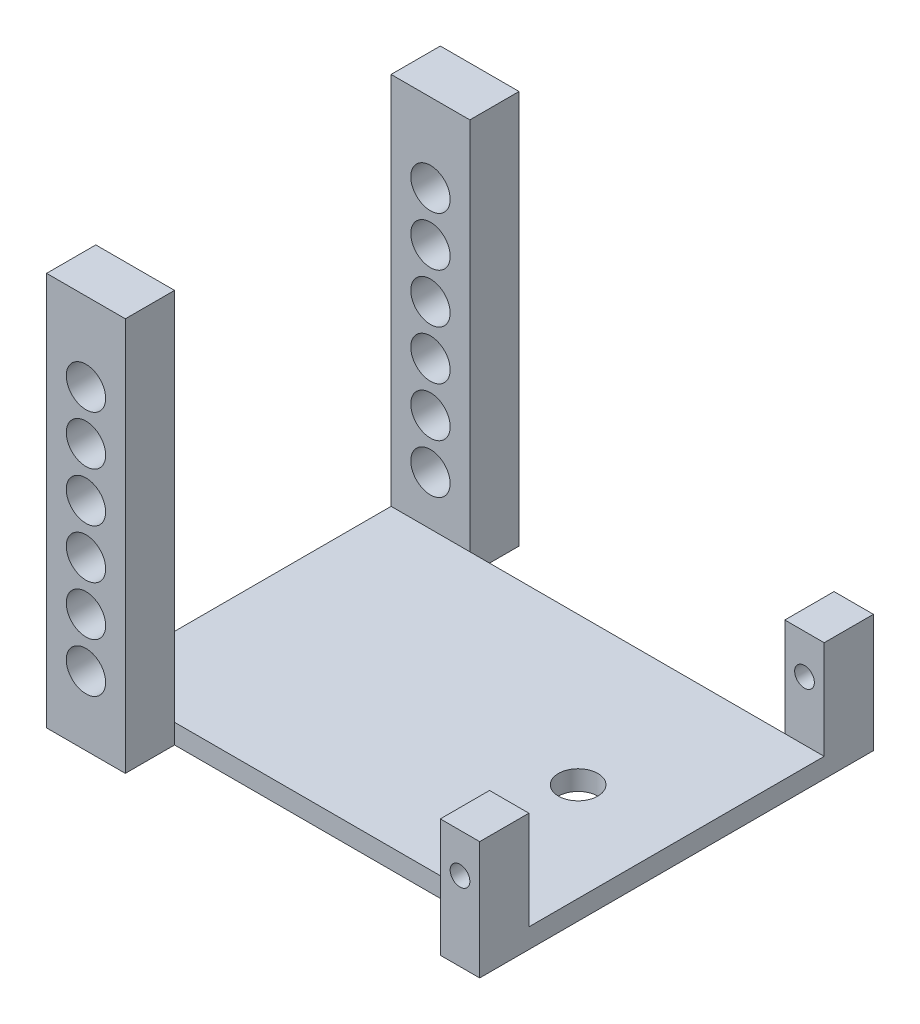
ISO-10303-21;
HEADER;
FILE_DESCRIPTION(('STEP AP214'),'2;1');
FILE_NAME('part.step','',(''),(''),'','','');
FILE_SCHEMA(('AUTOMOTIVE_DESIGN { 1 0 10303 214 1 1 1 1 }'));
ENDSEC;
DATA;
#1=APPLICATION_CONTEXT('core data for automotive mechanical design processes');
#2=APPLICATION_PROTOCOL_DEFINITION('international standard','automotive_design',2000,#1);
#3=PRODUCT_CONTEXT('',#1,'mechanical');
#4=PRODUCT('Part','Part','',(#3));
#5=PRODUCT_RELATED_PRODUCT_CATEGORY('part','',(#4));
#6=PRODUCT_DEFINITION_FORMATION('','',#4);
#7=PRODUCT_DEFINITION_CONTEXT('part definition',#1,'design');
#8=PRODUCT_DEFINITION('design','',#6,#7);
#9=PRODUCT_DEFINITION_SHAPE('','',#8);
#10=(LENGTH_UNIT() NAMED_UNIT(*) SI_UNIT(.MILLI.,.METRE.));
#11=(NAMED_UNIT(*) PLANE_ANGLE_UNIT() SI_UNIT($,.RADIAN.));
#12=(NAMED_UNIT(*) SI_UNIT($,.STERADIAN.) SOLID_ANGLE_UNIT());
#13=UNCERTAINTY_MEASURE_WITH_UNIT(LENGTH_MEASURE(1.E-05),#10,'distance_accuracy_value','');
#14=(GEOMETRIC_REPRESENTATION_CONTEXT(3) GLOBAL_UNCERTAINTY_ASSIGNED_CONTEXT((#13)) GLOBAL_UNIT_ASSIGNED_CONTEXT((#10,
#11,#12)) REPRESENTATION_CONTEXT('',''));
#15=CARTESIAN_POINT('',(0.,0.,0.));
#16=DIRECTION('',(0.,0.,1.));
#17=DIRECTION('',(1.,0.,0.));
#18=AXIS2_PLACEMENT_3D('',#15,#16,#17);
#19=CARTESIAN_POINT('',(-100.,10.,-75.));
#20=DIRECTION('',(0.,0.,1.));
#21=DIRECTION('',(1.,0.,0.));
#22=AXIS2_PLACEMENT_3D('',#19,#20,#21);
#23=PLANE('',#22);
#24=DIRECTION('',(0.,-1.,0.));
#25=VECTOR('',#24,1.);
#26=CARTESIAN_POINT('',(-80.,0.,-75.));
#27=LINE('',#26,#25);
#28=CARTESIAN_POINT('',(-80.,10.,-75.));
#29=VERTEX_POINT('',#28);
#30=CARTESIAN_POINT('',(-80.,0.,-75.));
#31=VERTEX_POINT('',#30);
#32=EDGE_CURVE('E206',#29,#31,#27,.T.);
#33=ORIENTED_EDGE('',*,*,#32,.F.);
#34=DIRECTION('',(-1.,0.,0.));
#35=VECTOR('',#34,1.);
#36=CARTESIAN_POINT('',(-100.,10.,-75.));
#37=LINE('',#36,#35);
#38=CARTESIAN_POINT('',(80.,10.,-75.));
#39=VERTEX_POINT('',#38);
#40=EDGE_CURVE('E348',#39,#29,#37,.T.);
#41=ORIENTED_EDGE('',*,*,#40,.F.);
#42=DIRECTION('',(0.,1.,0.));
#43=VECTOR('',#42,1.);
#44=CARTESIAN_POINT('',(80.,60.,-75.));
#45=LINE('',#44,#43);
#46=CARTESIAN_POINT('',(80.,0.,-75.));
#47=VERTEX_POINT('',#46);
#48=EDGE_CURVE('E64',#47,#39,#45,.T.);
#49=ORIENTED_EDGE('',*,*,#48,.F.);
#50=DIRECTION('',(-1.,0.,0.));
#51=VECTOR('',#50,1.);
#52=CARTESIAN_POINT('',(-100.,0.,-75.));
#53=LINE('',#52,#51);
#54=EDGE_CURVE('E358',#47,#31,#53,.T.);
#55=ORIENTED_EDGE('',*,*,#54,.T.);
#56=EDGE_LOOP('',(#33,#41,#49,#55));
#57=FACE_BOUND('',#56,.T.);
#58=ADVANCED_FACE('F45',(#57),#23,.F.);
#59=CARTESIAN_POINT('',(-100.,10.,75.));
#60=DIRECTION('',(0.,0.,-1.));
#61=DIRECTION('',(-1.,0.,0.));
#62=AXIS2_PLACEMENT_3D('',#59,#60,#61);
#63=PLANE('',#62);
#64=DIRECTION('',(0.,1.,0.));
#65=VECTOR('',#64,1.);
#66=CARTESIAN_POINT('',(-80.,200.,75.));
#67=LINE('',#66,#65);
#68=CARTESIAN_POINT('',(-80.,0.,75.));
#69=VERTEX_POINT('',#68);
#70=CARTESIAN_POINT('',(-80.,10.,75.));
#71=VERTEX_POINT('',#70);
#72=EDGE_CURVE('E280',#69,#71,#67,.T.);
#73=ORIENTED_EDGE('',*,*,#72,.F.);
#74=DIRECTION('',(1.,0.,0.));
#75=VECTOR('',#74,1.);
#76=CARTESIAN_POINT('',(-100.,0.,75.));
#77=LINE('',#76,#75);
#78=CARTESIAN_POINT('',(80.,0.,75.));
#79=VERTEX_POINT('',#78);
#80=EDGE_CURVE('E349',#69,#79,#77,.T.);
#81=ORIENTED_EDGE('',*,*,#80,.T.);
#82=DIRECTION('',(0.,-1.,0.));
#83=VECTOR('',#82,1.);
#84=CARTESIAN_POINT('',(80.,60.,75.));
#85=LINE('',#84,#83);
#86=CARTESIAN_POINT('',(80.,10.,75.));
#87=VERTEX_POINT('',#86);
#88=EDGE_CURVE('E11',#87,#79,#85,.T.);
#89=ORIENTED_EDGE('',*,*,#88,.F.);
#90=DIRECTION('',(1.,0.,0.));
#91=VECTOR('',#90,1.);
#92=CARTESIAN_POINT('',(-100.,10.,75.));
#93=LINE('',#92,#91);
#94=EDGE_CURVE('E72',#71,#87,#93,.T.);
#95=ORIENTED_EDGE('',*,*,#94,.F.);
#96=EDGE_LOOP('',(#73,#81,#89,#95));
#97=FACE_BOUND('',#96,.T.);
#98=ADVANCED_FACE('F515',(#97),#63,.F.);
#99=CARTESIAN_POINT('',(100.,10.,-75.));
#100=DIRECTION('',(-1.,0.,0.));
#101=DIRECTION('',(0.,0.,1.));
#102=AXIS2_PLACEMENT_3D('',#99,#100,#101);
#103=PLANE('',#102);
#104=DIRECTION('',(0.,0.,-1.));
#105=VECTOR('',#104,1.);
#106=CARTESIAN_POINT('',(100.,0.,-75.));
#107=LINE('',#106,#105);
#108=CARTESIAN_POINT('',(100.,0.,100.));
#109=VERTEX_POINT('',#108);
#110=CARTESIAN_POINT('',(100.,0.,-100.));
#111=VERTEX_POINT('',#110);
#112=EDGE_CURVE('E341',#109,#111,#107,.T.);
#113=ORIENTED_EDGE('',*,*,#112,.T.);
#114=DIRECTION('',(0.,-1.,0.));
#115=VECTOR('',#114,1.);
#116=CARTESIAN_POINT('',(100.,0.,-100.));
#117=LINE('',#116,#115);
#118=CARTESIAN_POINT('',(100.,60.,-100.));
#119=VERTEX_POINT('',#118);
#120=EDGE_CURVE('E236',#119,#111,#117,.T.);
#121=ORIENTED_EDGE('',*,*,#120,.F.);
#122=DIRECTION('',(0.,0.,1.));
#123=VECTOR('',#122,1.);
#124=CARTESIAN_POINT('',(100.,60.,-100.));
#125=LINE('',#124,#123);
#126=CARTESIAN_POINT('',(100.,60.,-75.));
#127=VERTEX_POINT('',#126);
#128=EDGE_CURVE('E240',#119,#127,#125,.T.);
#129=ORIENTED_EDGE('',*,*,#128,.T.);
#130=DIRECTION('',(0.,-1.,0.));
#131=VECTOR('',#130,1.);
#132=CARTESIAN_POINT('',(100.,0.,-75.));
#133=LINE('',#132,#131);
#134=CARTESIAN_POINT('',(100.,10.,-75.));
#135=VERTEX_POINT('',#134);
#136=EDGE_CURVE('E230',#127,#135,#133,.T.);
#137=ORIENTED_EDGE('',*,*,#136,.T.);
#138=DIRECTION('',(0.,0.,-1.));
#139=VECTOR('',#138,1.);
#140=CARTESIAN_POINT('',(100.,10.,-75.));
#141=LINE('',#140,#139);
#142=CARTESIAN_POINT('',(100.,10.,75.));
#143=VERTEX_POINT('',#142);
#144=EDGE_CURVE('E345',#143,#135,#141,.T.);
#145=ORIENTED_EDGE('',*,*,#144,.F.);
#146=DIRECTION('',(0.,1.,0.));
#147=VECTOR('',#146,1.);
#148=CARTESIAN_POINT('',(100.,0.,75.));
#149=LINE('',#148,#147);
#150=CARTESIAN_POINT('',(100.,60.,75.));
#151=VERTEX_POINT('',#150);
#152=EDGE_CURVE('E284',#143,#151,#149,.T.);
#153=ORIENTED_EDGE('',*,*,#152,.T.);
#154=DIRECTION('',(0.,0.,-1.));
#155=VECTOR('',#154,1.);
#156=CARTESIAN_POINT('',(100.,60.,100.));
#157=LINE('',#156,#155);
#158=CARTESIAN_POINT('',(100.,60.,100.));
#159=VERTEX_POINT('',#158);
#160=EDGE_CURVE('E325',#159,#151,#157,.T.);
#161=ORIENTED_EDGE('',*,*,#160,.F.);
#162=DIRECTION('',(0.,1.,0.));
#163=VECTOR('',#162,1.);
#164=CARTESIAN_POINT('',(100.,0.,100.));
#165=LINE('',#164,#163);
#166=EDGE_CURVE('E301',#109,#159,#165,.T.);
#167=ORIENTED_EDGE('',*,*,#166,.F.);
#168=EDGE_LOOP('',(#113,#121,#129,#137,#145,#153,#161,#167));
#169=FACE_BOUND('',#168,.T.);
#170=ADVANCED_FACE('F47',(#169),#103,.F.);
#171=CARTESIAN_POINT('',(0.,10.,0.));
#172=DIRECTION('',(0.,1.,0.));
#173=DIRECTION('',(0.,0.,1.));
#174=AXIS2_PLACEMENT_3D('',#171,#172,#173);
#175=PLANE('',#174);
#176=CARTESIAN_POINT('',(50.,10.,0.));
#177=DIRECTION('',(0.,1.,0.));
#178=DIRECTION('',(0.,0.,1.));
#179=AXIS2_PLACEMENT_3D('',#176,#177,#178);
#180=CIRCLE('',#179,10.);
#181=CARTESIAN_POINT('',(50.,10.,9.99999999999999));
#182=VERTEX_POINT('',#181);
#183=EDGE_CURVE('E336',#182,#182,#180,.T.);
#184=ORIENTED_EDGE('',*,*,#183,.F.);
#185=EDGE_LOOP('',(#184));
#186=FACE_BOUND('',#185,.T.);
#187=ORIENTED_EDGE('',*,*,#144,.T.);
#188=EDGE_CURVE('E350',#135,#39,#37,.T.);
#189=ORIENTED_EDGE('',*,*,#188,.T.);
#190=ORIENTED_EDGE('',*,*,#40,.T.);
#191=DIRECTION('',(1.,0.,0.));
#192=VECTOR('',#191,1.);
#193=CARTESIAN_POINT('',(0.,10.,-75.));
#194=LINE('',#193,#192);
#195=CARTESIAN_POINT('',(-120.,10.,-75.));
#196=VERTEX_POINT('',#195);
#197=EDGE_CURVE('E204',#196,#29,#194,.T.);
#198=ORIENTED_EDGE('',*,*,#197,.F.);
#199=DIRECTION('',(0.,0.,-1.));
#200=VECTOR('',#199,1.);
#201=CARTESIAN_POINT('',(-120.,10.,-75.));
#202=LINE('',#201,#200);
#203=CARTESIAN_POINT('',(-120.,10.,75.));
#204=VERTEX_POINT('',#203);
#205=EDGE_CURVE('E329',#204,#196,#202,.T.);
#206=ORIENTED_EDGE('',*,*,#205,.F.);
#207=EDGE_CURVE('E55',#204,#71,#93,.T.);
#208=ORIENTED_EDGE('',*,*,#207,.T.);
#209=ORIENTED_EDGE('',*,*,#94,.T.);
#210=EDGE_CURVE('E353',#87,#143,#93,.T.);
#211=ORIENTED_EDGE('',*,*,#210,.T.);
#212=EDGE_LOOP('',(#187,#189,#190,#198,#206,#208,#209,#211));
#213=FACE_BOUND('',#212,.T.);
#214=ADVANCED_FACE('F528',(#186,#213),#175,.T.);
#215=CARTESIAN_POINT('',(0.,0.,0.));
#216=DIRECTION('',(0.,1.,0.));
#217=DIRECTION('',(0.,0.,1.));
#218=AXIS2_PLACEMENT_3D('',#215,#216,#217);
#219=PLANE('',#218);
#220=CARTESIAN_POINT('',(50.,0.,0.));
#221=DIRECTION('',(0.,1.,0.));
#222=DIRECTION('',(0.,0.,1.));
#223=AXIS2_PLACEMENT_3D('',#220,#221,#222);
#224=CIRCLE('',#223,10.);
#225=CARTESIAN_POINT('',(50.,0.,9.99999999999999));
#226=VERTEX_POINT('',#225);
#227=EDGE_CURVE('E337',#226,#226,#224,.T.);
#228=ORIENTED_EDGE('',*,*,#227,.T.);
#229=EDGE_LOOP('',(#228));
#230=FACE_BOUND('',#229,.T.);
#231=ORIENTED_EDGE('',*,*,#112,.F.);
#232=DIRECTION('',(1.,0.,0.));
#233=VECTOR('',#232,1.);
#234=CARTESIAN_POINT('',(80.,0.,100.));
#235=LINE('',#234,#233);
#236=CARTESIAN_POINT('',(80.,0.,100.));
#237=VERTEX_POINT('',#236);
#238=EDGE_CURVE('E297',#237,#109,#235,.T.);
#239=ORIENTED_EDGE('',*,*,#238,.F.);
#240=DIRECTION('',(0.,0.,-1.));
#241=VECTOR('',#240,1.);
#242=CARTESIAN_POINT('',(80.,0.,100.));
#243=LINE('',#242,#241);
#244=EDGE_CURVE('E310',#237,#79,#243,.T.);
#245=ORIENTED_EDGE('',*,*,#244,.T.);
#246=ORIENTED_EDGE('',*,*,#80,.F.);
#247=DIRECTION('',(0.,0.,-1.));
#248=VECTOR('',#247,1.);
#249=CARTESIAN_POINT('',(-80.,0.,100.));
#250=LINE('',#249,#248);
#251=CARTESIAN_POINT('',(-80.,0.,100.));
#252=VERTEX_POINT('',#251);
#253=EDGE_CURVE('E260',#252,#69,#250,.T.);
#254=ORIENTED_EDGE('',*,*,#253,.F.);
#255=DIRECTION('',(1.,0.,0.));
#256=VECTOR('',#255,1.);
#257=CARTESIAN_POINT('',(-80.,0.,100.));
#258=LINE('',#257,#256);
#259=CARTESIAN_POINT('',(-120.,0.,100.));
#260=VERTEX_POINT('',#259);
#261=EDGE_CURVE('E276',#260,#252,#258,.T.);
#262=ORIENTED_EDGE('',*,*,#261,.F.);
#263=DIRECTION('',(0.,0.,1.));
#264=VECTOR('',#263,1.);
#265=CARTESIAN_POINT('',(-120.,0.,-75.));
#266=LINE('',#265,#264);
#267=CARTESIAN_POINT('',(-120.,0.,-100.));
#268=VERTEX_POINT('',#267);
#269=EDGE_CURVE('E333',#268,#260,#266,.T.);
#270=ORIENTED_EDGE('',*,*,#269,.F.);
#271=DIRECTION('',(-1.,0.,0.));
#272=VECTOR('',#271,1.);
#273=CARTESIAN_POINT('',(-120.,0.,-100.));
#274=LINE('',#273,#272);
#275=CARTESIAN_POINT('',(-80.,0.,-100.));
#276=VERTEX_POINT('',#275);
#277=EDGE_CURVE('E219',#276,#268,#274,.T.);
#278=ORIENTED_EDGE('',*,*,#277,.F.);
#279=DIRECTION('',(0.,0.,1.));
#280=VECTOR('',#279,1.);
#281=CARTESIAN_POINT('',(-80.,0.,-100.));
#282=LINE('',#281,#280);
#283=EDGE_CURVE('E434',#276,#31,#282,.T.);
#284=ORIENTED_EDGE('',*,*,#283,.T.);
#285=ORIENTED_EDGE('',*,*,#54,.F.);
#286=DIRECTION('',(0.,0.,1.));
#287=VECTOR('',#286,1.);
#288=CARTESIAN_POINT('',(80.,0.,-100.));
#289=LINE('',#288,#287);
#290=CARTESIAN_POINT('',(80.,0.,-100.));
#291=VERTEX_POINT('',#290);
#292=EDGE_CURVE('E256',#291,#47,#289,.T.);
#293=ORIENTED_EDGE('',*,*,#292,.F.);
#294=DIRECTION('',(-1.,0.,0.));
#295=VECTOR('',#294,1.);
#296=CARTESIAN_POINT('',(80.,0.,-100.));
#297=LINE('',#296,#295);
#298=EDGE_CURVE('E225',#111,#291,#297,.T.);
#299=ORIENTED_EDGE('',*,*,#298,.F.);
#300=EDGE_LOOP('',(#231,#239,#245,#246,#254,#262,#270,#278,#284,#285,#293,#299));
#301=FACE_BOUND('',#300,.T.);
#302=ADVANCED_FACE('F524',(#230,#301),#219,.F.);
#303=CARTESIAN_POINT('',(50.,0.,0.));
#304=DIRECTION('',(0.,1.,0.));
#305=DIRECTION('',(0.,0.,1.));
#306=AXIS2_PLACEMENT_3D('',#303,#304,#305);
#307=CYLINDRICAL_SURFACE('',#306,10.);
#308=ORIENTED_EDGE('',*,*,#227,.F.);
#309=EDGE_LOOP('',(#308));
#310=FACE_BOUND('',#309,.T.);
#311=ORIENTED_EDGE('',*,*,#183,.T.);
#312=EDGE_LOOP('',(#311));
#313=FACE_BOUND('',#312,.T.);
#314=ADVANCED_FACE('F527',(#310,#313),#307,.F.);
#315=CARTESIAN_POINT('',(-120.,0.,0.));
#316=DIRECTION('',(-1.,0.,0.));
#317=DIRECTION('',(0.,0.,1.));
#318=AXIS2_PLACEMENT_3D('',#315,#316,#317);
#319=PLANE('',#318);
#320=ORIENTED_EDGE('',*,*,#269,.T.);
#321=DIRECTION('',(0.,-1.,0.));
#322=VECTOR('',#321,1.);
#323=CARTESIAN_POINT('',(-120.,200.,100.));
#324=LINE('',#323,#322);
#325=CARTESIAN_POINT('',(-120.,200.,100.));
#326=VERTEX_POINT('',#325);
#327=EDGE_CURVE('E271',#326,#260,#324,.T.);
#328=ORIENTED_EDGE('',*,*,#327,.F.);
#329=DIRECTION('',(0.,0.,-1.));
#330=VECTOR('',#329,1.);
#331=CARTESIAN_POINT('',(-120.,200.,100.));
#332=LINE('',#331,#330);
#333=CARTESIAN_POINT('',(-120.,200.,75.));
#334=VERTEX_POINT('',#333);
#335=EDGE_CURVE('E267',#326,#334,#332,.T.);
#336=ORIENTED_EDGE('',*,*,#335,.T.);
#337=DIRECTION('',(0.,-1.,0.));
#338=VECTOR('',#337,1.);
#339=CARTESIAN_POINT('',(-120.,200.,75.));
#340=LINE('',#339,#338);
#341=EDGE_CURVE('E272',#334,#204,#340,.T.);
#342=ORIENTED_EDGE('',*,*,#341,.T.);
#343=ORIENTED_EDGE('',*,*,#205,.T.);
#344=DIRECTION('',(0.,1.,0.));
#345=VECTOR('',#344,1.);
#346=CARTESIAN_POINT('',(-120.,200.,-75.));
#347=LINE('',#346,#345);
#348=CARTESIAN_POINT('',(-120.,200.,-75.));
#349=VERTEX_POINT('',#348);
#350=EDGE_CURVE('E189',#196,#349,#347,.T.);
#351=ORIENTED_EDGE('',*,*,#350,.T.);
#352=DIRECTION('',(0.,0.,1.));
#353=VECTOR('',#352,1.);
#354=CARTESIAN_POINT('',(-120.,200.,-100.));
#355=LINE('',#354,#353);
#356=CARTESIAN_POINT('',(-120.,200.,-100.));
#357=VERTEX_POINT('',#356);
#358=EDGE_CURVE('E185',#357,#349,#355,.T.);
#359=ORIENTED_EDGE('',*,*,#358,.F.);
#360=DIRECTION('',(0.,1.,0.));
#361=VECTOR('',#360,1.);
#362=CARTESIAN_POINT('',(-120.,200.,-100.));
#363=LINE('',#362,#361);
#364=EDGE_CURVE('E216',#268,#357,#363,.T.);
#365=ORIENTED_EDGE('',*,*,#364,.F.);
#366=EDGE_LOOP('',(#320,#328,#336,#342,#343,#351,#359,#365));
#367=FACE_BOUND('',#366,.T.);
#368=ADVANCED_FACE('F535',(#367),#319,.T.);
#369=CARTESIAN_POINT('',(100.,60.,100.));
#370=DIRECTION('',(0.,-1.,0.));
#371=DIRECTION('',(0.,0.,-1.));
#372=AXIS2_PLACEMENT_3D('',#369,#370,#371);
#373=PLANE('',#372);
#374=DIRECTION('',(-1.,0.,0.));
#375=VECTOR('',#374,1.);
#376=CARTESIAN_POINT('',(100.,60.,75.));
#377=LINE('',#376,#375);
#378=CARTESIAN_POINT('',(80.,60.,75.));
#379=VERTEX_POINT('',#378);
#380=EDGE_CURVE('E313',#151,#379,#377,.T.);
#381=ORIENTED_EDGE('',*,*,#380,.T.);
#382=DIRECTION('',(0.,0.,-1.));
#383=VECTOR('',#382,1.);
#384=CARTESIAN_POINT('',(80.,60.,100.));
#385=LINE('',#384,#383);
#386=CARTESIAN_POINT('',(80.,60.,100.));
#387=VERTEX_POINT('',#386);
#388=EDGE_CURVE('E321',#387,#379,#385,.T.);
#389=ORIENTED_EDGE('',*,*,#388,.F.);
#390=DIRECTION('',(-1.,0.,0.));
#391=VECTOR('',#390,1.);
#392=CARTESIAN_POINT('',(100.,60.,100.));
#393=LINE('',#392,#391);
#394=EDGE_CURVE('E304',#159,#387,#393,.T.);
#395=ORIENTED_EDGE('',*,*,#394,.F.);
#396=ORIENTED_EDGE('',*,*,#160,.T.);
#397=EDGE_LOOP('',(#381,#389,#395,#396));
#398=FACE_BOUND('',#397,.T.);
#399=ADVANCED_FACE('F539',(#398),#373,.F.);
#400=CARTESIAN_POINT('',(80.,60.,100.));
#401=DIRECTION('',(1.,0.,0.));
#402=DIRECTION('',(0.,1.,0.));
#403=AXIS2_PLACEMENT_3D('',#400,#401,#402);
#404=PLANE('',#403);
#405=EDGE_CURVE('E57',#379,#87,#85,.T.);
#406=ORIENTED_EDGE('',*,*,#405,.T.);
#407=ORIENTED_EDGE('',*,*,#88,.T.);
#408=ORIENTED_EDGE('',*,*,#244,.F.);
#409=DIRECTION('',(0.,-1.,0.));
#410=VECTOR('',#409,1.);
#411=CARTESIAN_POINT('',(80.,60.,100.));
#412=LINE('',#411,#410);
#413=EDGE_CURVE('E307',#387,#237,#412,.T.);
#414=ORIENTED_EDGE('',*,*,#413,.F.);
#415=ORIENTED_EDGE('',*,*,#388,.T.);
#416=EDGE_LOOP('',(#406,#407,#408,#414,#415));
#417=FACE_BOUND('',#416,.T.);
#418=ADVANCED_FACE('F543',(#417),#404,.F.);
#419=CARTESIAN_POINT('',(0.,0.,100.));
#420=DIRECTION('',(0.,0.,1.));
#421=DIRECTION('',(1.,0.,0.));
#422=AXIS2_PLACEMENT_3D('',#419,#420,#421);
#423=PLANE('',#422);
#424=CARTESIAN_POINT('',(90.,40.,100.));
#425=DIRECTION('',(0.,0.,1.));
#426=DIRECTION('',(1.,0.,0.));
#427=AXIS2_PLACEMENT_3D('',#424,#425,#426);
#428=CIRCLE('',#427,5.00000000000001);
#429=CARTESIAN_POINT('',(95.,40.,100.));
#430=VERTEX_POINT('',#429);
#431=EDGE_CURVE('E430',#430,#430,#428,.T.);
#432=ORIENTED_EDGE('',*,*,#431,.F.);
#433=EDGE_LOOP('',(#432));
#434=FACE_BOUND('',#433,.T.);
#435=ORIENTED_EDGE('',*,*,#238,.T.);
#436=ORIENTED_EDGE('',*,*,#166,.T.);
#437=ORIENTED_EDGE('',*,*,#394,.T.);
#438=ORIENTED_EDGE('',*,*,#413,.T.);
#439=EDGE_LOOP('',(#435,#436,#437,#438));
#440=FACE_BOUND('',#439,.T.);
#441=ADVANCED_FACE('F547',(#434,#440),#423,.T.);
#442=CARTESIAN_POINT('',(0.,0.,75.));
#443=DIRECTION('',(0.,0.,1.));
#444=DIRECTION('',(1.,0.,0.));
#445=AXIS2_PLACEMENT_3D('',#442,#443,#444);
#446=PLANE('',#445);
#447=CARTESIAN_POINT('',(90.,40.,75.));
#448=DIRECTION('',(0.,0.,1.));
#449=DIRECTION('',(1.,0.,0.));
#450=AXIS2_PLACEMENT_3D('',#447,#448,#449);
#451=CIRCLE('',#450,5.00000000000001);
#452=CARTESIAN_POINT('',(95.,40.,75.));
#453=VERTEX_POINT('',#452);
#454=EDGE_CURVE('E426',#453,#453,#451,.T.);
#455=ORIENTED_EDGE('',*,*,#454,.T.);
#456=EDGE_LOOP('',(#455));
#457=FACE_BOUND('',#456,.T.);
#458=ORIENTED_EDGE('',*,*,#210,.F.);
#459=ORIENTED_EDGE('',*,*,#405,.F.);
#460=ORIENTED_EDGE('',*,*,#380,.F.);
#461=ORIENTED_EDGE('',*,*,#152,.F.);
#462=EDGE_LOOP('',(#458,#459,#460,#461));
#463=FACE_BOUND('',#462,.T.);
#464=ADVANCED_FACE('F549',(#457,#463),#446,.F.);
#465=CARTESIAN_POINT('',(-80.,200.,100.));
#466=DIRECTION('',(-1.,0.,0.));
#467=DIRECTION('',(0.,0.,1.));
#468=AXIS2_PLACEMENT_3D('',#465,#466,#467);
#469=PLANE('',#468);
#470=ORIENTED_EDGE('',*,*,#72,.T.);
#471=CARTESIAN_POINT('',(-80.,200.,75.));
#472=VERTEX_POINT('',#471);
#473=EDGE_CURVE('E279',#71,#472,#67,.T.);
#474=ORIENTED_EDGE('',*,*,#473,.T.);
#475=DIRECTION('',(0.,0.,-1.));
#476=VECTOR('',#475,1.);
#477=CARTESIAN_POINT('',(-80.,200.,100.));
#478=LINE('',#477,#476);
#479=CARTESIAN_POINT('',(-80.,200.,100.));
#480=VERTEX_POINT('',#479);
#481=EDGE_CURVE('E263',#480,#472,#478,.T.);
#482=ORIENTED_EDGE('',*,*,#481,.F.);
#483=DIRECTION('',(0.,1.,0.));
#484=VECTOR('',#483,1.);
#485=CARTESIAN_POINT('',(-80.,200.,100.));
#486=LINE('',#485,#484);
#487=EDGE_CURVE('E291',#252,#480,#486,.T.);
#488=ORIENTED_EDGE('',*,*,#487,.F.);
#489=ORIENTED_EDGE('',*,*,#253,.T.);
#490=EDGE_LOOP('',(#470,#474,#482,#488,#489));
#491=FACE_BOUND('',#490,.T.);
#492=ADVANCED_FACE('F552',(#491),#469,.F.);
#493=CARTESIAN_POINT('',(-100.,200.,100.));
#494=DIRECTION('',(0.,-1.,0.));
#495=DIRECTION('',(1.,0.,0.));
#496=AXIS2_PLACEMENT_3D('',#493,#494,#495);
#497=PLANE('',#496);
#498=DIRECTION('',(-1.,0.,0.));
#499=VECTOR('',#498,1.);
#500=CARTESIAN_POINT('',(-100.,200.,75.));
#501=LINE('',#500,#499);
#502=EDGE_CURVE('E275',#472,#334,#501,.T.);
#503=ORIENTED_EDGE('',*,*,#502,.T.);
#504=ORIENTED_EDGE('',*,*,#335,.F.);
#505=DIRECTION('',(-1.,0.,0.));
#506=VECTOR('',#505,1.);
#507=CARTESIAN_POINT('',(-100.,200.,100.));
#508=LINE('',#507,#506);
#509=EDGE_CURVE('E288',#480,#326,#508,.T.);
#510=ORIENTED_EDGE('',*,*,#509,.F.);
#511=ORIENTED_EDGE('',*,*,#481,.T.);
#512=EDGE_LOOP('',(#503,#504,#510,#511));
#513=FACE_BOUND('',#512,.T.);
#514=ADVANCED_FACE('F560',(#513),#497,.F.);
#515=CARTESIAN_POINT('',(0.,0.,100.));
#516=DIRECTION('',(0.,0.,1.));
#517=DIRECTION('',(1.,0.,0.));
#518=AXIS2_PLACEMENT_3D('',#515,#516,#517);
#519=PLANE('',#518);
#520=CARTESIAN_POINT('',(-100.,160.,100.));
#521=DIRECTION('',(0.,0.,1.));
#522=DIRECTION('',(1.,0.,0.));
#523=AXIS2_PLACEMENT_3D('',#520,#521,#522);
#524=CIRCLE('',#523,10.);
#525=CARTESIAN_POINT('',(-90.,160.,100.));
#526=VERTEX_POINT('',#525);
#527=EDGE_CURVE('E368',#526,#526,#524,.T.);
#528=ORIENTED_EDGE('',*,*,#527,.F.);
#529=EDGE_LOOP('',(#528));
#530=FACE_BOUND('',#529,.T.);
#531=CARTESIAN_POINT('',(-100.,60.,100.));
#532=DIRECTION('',(0.,0.,1.));
#533=DIRECTION('',(1.,0.,0.));
#534=AXIS2_PLACEMENT_3D('',#531,#532,#533);
#535=CIRCLE('',#534,9.99999999999999);
#536=CARTESIAN_POINT('',(-90.,60.,100.));
#537=VERTEX_POINT('',#536);
#538=EDGE_CURVE('E833',#537,#537,#535,.T.);
#539=ORIENTED_EDGE('',*,*,#538,.F.);
#540=EDGE_LOOP('',(#539));
#541=FACE_BOUND('',#540,.T.);
#542=CARTESIAN_POINT('',(-100.,35.,100.));
#543=DIRECTION('',(0.,0.,1.));
#544=DIRECTION('',(1.,0.,0.));
#545=AXIS2_PLACEMENT_3D('',#542,#543,#544);
#546=CIRCLE('',#545,9.99999999999999);
#547=CARTESIAN_POINT('',(-90.,35.,100.));
#548=VERTEX_POINT('',#547);
#549=EDGE_CURVE('E476',#548,#548,#546,.T.);
#550=ORIENTED_EDGE('',*,*,#549,.F.);
#551=EDGE_LOOP('',(#550));
#552=FACE_BOUND('',#551,.T.);
#553=CARTESIAN_POINT('',(-100.,85.,100.));
#554=DIRECTION('',(0.,0.,1.));
#555=DIRECTION('',(1.,0.,0.));
#556=AXIS2_PLACEMENT_3D('',#553,#554,#555);
#557=CIRCLE('',#556,9.99999999999999);
#558=CARTESIAN_POINT('',(-90.,85.,100.));
#559=VERTEX_POINT('',#558);
#560=EDGE_CURVE('E839',#559,#559,#557,.T.);
#561=ORIENTED_EDGE('',*,*,#560,.F.);
#562=EDGE_LOOP('',(#561));
#563=FACE_BOUND('',#562,.T.);
#564=CARTESIAN_POINT('',(-100.,110.,100.));
#565=DIRECTION('',(0.,0.,1.));
#566=DIRECTION('',(1.,0.,0.));
#567=AXIS2_PLACEMENT_3D('',#564,#565,#566);
#568=CIRCLE('',#567,9.99999999999999);
#569=CARTESIAN_POINT('',(-90.,110.,100.));
#570=VERTEX_POINT('',#569);
#571=EDGE_CURVE('E830',#570,#570,#568,.T.);
#572=ORIENTED_EDGE('',*,*,#571,.F.);
#573=EDGE_LOOP('',(#572));
#574=FACE_BOUND('',#573,.T.);
#575=CARTESIAN_POINT('',(-100.,135.,100.));
#576=DIRECTION('',(0.,0.,1.));
#577=DIRECTION('',(1.,0.,0.));
#578=AXIS2_PLACEMENT_3D('',#575,#576,#577);
#579=CIRCLE('',#578,10.);
#580=CARTESIAN_POINT('',(-90.,135.,100.));
#581=VERTEX_POINT('',#580);
#582=EDGE_CURVE('E826',#581,#581,#579,.T.);
#583=ORIENTED_EDGE('',*,*,#582,.F.);
#584=EDGE_LOOP('',(#583));
#585=FACE_BOUND('',#584,.T.);
#586=ORIENTED_EDGE('',*,*,#261,.T.);
#587=ORIENTED_EDGE('',*,*,#487,.T.);
#588=ORIENTED_EDGE('',*,*,#509,.T.);
#589=ORIENTED_EDGE('',*,*,#327,.T.);
#590=EDGE_LOOP('',(#586,#587,#588,#589));
#591=FACE_BOUND('',#590,.T.);
#592=ADVANCED_FACE('F557',(#530,#541,#552,#563,#574,#585,#591),#519,.T.);
#593=CARTESIAN_POINT('',(0.,0.,75.));
#594=DIRECTION('',(0.,0.,1.));
#595=DIRECTION('',(1.,0.,0.));
#596=AXIS2_PLACEMENT_3D('',#593,#594,#595);
#597=PLANE('',#596);
#598=CARTESIAN_POINT('',(-100.,160.,75.));
#599=DIRECTION('',(0.,0.,1.));
#600=DIRECTION('',(1.,0.,0.));
#601=AXIS2_PLACEMENT_3D('',#598,#599,#600);
#602=CIRCLE('',#601,10.);
#603=CARTESIAN_POINT('',(-90.,160.,75.));
#604=VERTEX_POINT('',#603);
#605=EDGE_CURVE('E414',#604,#604,#602,.T.);
#606=ORIENTED_EDGE('',*,*,#605,.T.);
#607=EDGE_LOOP('',(#606));
#608=FACE_BOUND('',#607,.T.);
#609=CARTESIAN_POINT('',(-100.,60.,75.));
#610=DIRECTION('',(0.,0.,1.));
#611=DIRECTION('',(1.,0.,0.));
#612=AXIS2_PLACEMENT_3D('',#609,#610,#611);
#613=CIRCLE('',#612,9.99999999999999);
#614=CARTESIAN_POINT('',(-90.,60.,75.));
#615=VERTEX_POINT('',#614);
#616=EDGE_CURVE('E396',#615,#615,#613,.T.);
#617=ORIENTED_EDGE('',*,*,#616,.T.);
#618=EDGE_LOOP('',(#617));
#619=FACE_BOUND('',#618,.T.);
#620=CARTESIAN_POINT('',(-100.,35.,75.));
#621=DIRECTION('',(0.,0.,1.));
#622=DIRECTION('',(1.,0.,0.));
#623=AXIS2_PLACEMENT_3D('',#620,#621,#622);
#624=CIRCLE('',#623,9.99999999999999);
#625=CARTESIAN_POINT('',(-90.,35.,75.));
#626=VERTEX_POINT('',#625);
#627=EDGE_CURVE('E390',#626,#626,#624,.T.);
#628=ORIENTED_EDGE('',*,*,#627,.T.);
#629=EDGE_LOOP('',(#628));
#630=FACE_BOUND('',#629,.T.);
#631=CARTESIAN_POINT('',(-100.,85.,75.));
#632=DIRECTION('',(0.,0.,1.));
#633=DIRECTION('',(1.,0.,0.));
#634=AXIS2_PLACEMENT_3D('',#631,#632,#633);
#635=CIRCLE('',#634,9.99999999999999);
#636=CARTESIAN_POINT('',(-90.,85.,75.));
#637=VERTEX_POINT('',#636);
#638=EDGE_CURVE('E385',#637,#637,#635,.T.);
#639=ORIENTED_EDGE('',*,*,#638,.T.);
#640=EDGE_LOOP('',(#639));
#641=FACE_BOUND('',#640,.T.);
#642=CARTESIAN_POINT('',(-100.,110.,75.));
#643=DIRECTION('',(0.,0.,1.));
#644=DIRECTION('',(1.,0.,0.));
#645=AXIS2_PLACEMENT_3D('',#642,#643,#644);
#646=CIRCLE('',#645,9.99999999999999);
#647=CARTESIAN_POINT('',(-90.,110.,75.));
#648=VERTEX_POINT('',#647);
#649=EDGE_CURVE('E380',#648,#648,#646,.T.);
#650=ORIENTED_EDGE('',*,*,#649,.T.);
#651=EDGE_LOOP('',(#650));
#652=FACE_BOUND('',#651,.T.);
#653=CARTESIAN_POINT('',(-100.,135.,75.));
#654=DIRECTION('',(0.,0.,1.));
#655=DIRECTION('',(1.,0.,0.));
#656=AXIS2_PLACEMENT_3D('',#653,#654,#655);
#657=CIRCLE('',#656,10.);
#658=CARTESIAN_POINT('',(-90.,135.,75.));
#659=VERTEX_POINT('',#658);
#660=EDGE_CURVE('E374',#659,#659,#657,.T.);
#661=ORIENTED_EDGE('',*,*,#660,.T.);
#662=EDGE_LOOP('',(#661));
#663=FACE_BOUND('',#662,.T.);
#664=ORIENTED_EDGE('',*,*,#207,.F.);
#665=ORIENTED_EDGE('',*,*,#341,.F.);
#666=ORIENTED_EDGE('',*,*,#502,.F.);
#667=ORIENTED_EDGE('',*,*,#473,.F.);
#668=EDGE_LOOP('',(#664,#665,#666,#667));
#669=FACE_BOUND('',#668,.T.);
#670=ADVANCED_FACE('F491',(#608,#619,#630,#641,#652,#663,#669),#597,.F.);
#671=CARTESIAN_POINT('',(0.,0.,-75.));
#672=DIRECTION('',(0.,0.,1.));
#673=DIRECTION('',(1.,0.,0.));
#674=AXIS2_PLACEMENT_3D('',#671,#672,#673);
#675=PLANE('',#674);
#676=CARTESIAN_POINT('',(90.,40.,-75.));
#677=DIRECTION('',(0.,0.,1.));
#678=DIRECTION('',(1.,0.,0.));
#679=AXIS2_PLACEMENT_3D('',#676,#677,#678);
#680=CIRCLE('',#679,5.00000000000001);
#681=CARTESIAN_POINT('',(95.,40.,-75.));
#682=VERTEX_POINT('',#681);
#683=EDGE_CURVE('E422',#682,#682,#680,.T.);
#684=ORIENTED_EDGE('',*,*,#683,.F.);
#685=EDGE_LOOP('',(#684));
#686=FACE_BOUND('',#685,.T.);
#687=ORIENTED_EDGE('',*,*,#188,.F.);
#688=ORIENTED_EDGE('',*,*,#136,.F.);
#689=DIRECTION('',(1.,0.,0.));
#690=VECTOR('',#689,1.);
#691=CARTESIAN_POINT('',(100.,60.,-75.));
#692=LINE('',#691,#690);
#693=CARTESIAN_POINT('',(80.,60.,-75.));
#694=VERTEX_POINT('',#693);
#695=EDGE_CURVE('E243',#694,#127,#692,.T.);
#696=ORIENTED_EDGE('',*,*,#695,.F.);
#697=EDGE_CURVE('E210',#39,#694,#45,.T.);
#698=ORIENTED_EDGE('',*,*,#697,.F.);
#699=EDGE_LOOP('',(#687,#688,#696,#698));
#700=FACE_BOUND('',#699,.T.);
#701=ADVANCED_FACE('F564',(#686,#700),#675,.T.);
#702=CARTESIAN_POINT('',(80.,60.,-100.));
#703=DIRECTION('',(1.,0.,0.));
#704=DIRECTION('',(0.,1.,0.));
#705=AXIS2_PLACEMENT_3D('',#702,#703,#704);
#706=PLANE('',#705);
#707=ORIENTED_EDGE('',*,*,#48,.T.);
#708=ORIENTED_EDGE('',*,*,#697,.T.);
#709=DIRECTION('',(0.,0.,1.));
#710=VECTOR('',#709,1.);
#711=CARTESIAN_POINT('',(80.,60.,-100.));
#712=LINE('',#711,#710);
#713=CARTESIAN_POINT('',(80.,60.,-100.));
#714=VERTEX_POINT('',#713);
#715=EDGE_CURVE('E252',#714,#694,#712,.T.);
#716=ORIENTED_EDGE('',*,*,#715,.F.);
#717=DIRECTION('',(0.,1.,0.));
#718=VECTOR('',#717,1.);
#719=CARTESIAN_POINT('',(80.,60.,-100.));
#720=LINE('',#719,#718);
#721=EDGE_CURVE('E229',#291,#714,#720,.T.);
#722=ORIENTED_EDGE('',*,*,#721,.F.);
#723=ORIENTED_EDGE('',*,*,#292,.T.);
#724=EDGE_LOOP('',(#707,#708,#716,#722,#723));
#725=FACE_BOUND('',#724,.T.);
#726=ADVANCED_FACE('F571',(#725),#706,.F.);
#727=CARTESIAN_POINT('',(100.,60.,-100.));
#728=DIRECTION('',(0.,-1.,0.));
#729=DIRECTION('',(0.,0.,-1.));
#730=AXIS2_PLACEMENT_3D('',#727,#728,#729);
#731=PLANE('',#730);
#732=ORIENTED_EDGE('',*,*,#695,.T.);
#733=ORIENTED_EDGE('',*,*,#128,.F.);
#734=DIRECTION('',(1.,0.,0.));
#735=VECTOR('',#734,1.);
#736=CARTESIAN_POINT('',(100.,60.,-100.));
#737=LINE('',#736,#735);
#738=EDGE_CURVE('E233',#714,#119,#737,.T.);
#739=ORIENTED_EDGE('',*,*,#738,.F.);
#740=ORIENTED_EDGE('',*,*,#715,.T.);
#741=EDGE_LOOP('',(#732,#733,#739,#740));
#742=FACE_BOUND('',#741,.T.);
#743=ADVANCED_FACE('F574',(#742),#731,.F.);
#744=CARTESIAN_POINT('',(0.,0.,-100.));
#745=DIRECTION('',(0.,0.,1.));
#746=DIRECTION('',(1.,0.,0.));
#747=AXIS2_PLACEMENT_3D('',#744,#745,#746);
#748=PLANE('',#747);
#749=CARTESIAN_POINT('',(90.,40.,-100.));
#750=DIRECTION('',(0.,0.,-1.));
#751=DIRECTION('',(-1.,0.,0.));
#752=AXIS2_PLACEMENT_3D('',#749,#750,#751);
#753=CIRCLE('',#752,5.00000000000001);
#754=CARTESIAN_POINT('',(85.,40.,-100.));
#755=VERTEX_POINT('',#754);
#756=EDGE_CURVE('E418',#755,#755,#753,.T.);
#757=ORIENTED_EDGE('',*,*,#756,.F.);
#758=EDGE_LOOP('',(#757));
#759=FACE_BOUND('',#758,.T.);
#760=ORIENTED_EDGE('',*,*,#298,.T.);
#761=ORIENTED_EDGE('',*,*,#721,.T.);
#762=ORIENTED_EDGE('',*,*,#738,.T.);
#763=ORIENTED_EDGE('',*,*,#120,.T.);
#764=EDGE_LOOP('',(#760,#761,#762,#763));
#765=FACE_BOUND('',#764,.T.);
#766=ADVANCED_FACE('F578',(#759,#765),#748,.F.);
#767=CARTESIAN_POINT('',(-80.,0.,-100.));
#768=DIRECTION('',(-1.,0.,0.));
#769=DIRECTION('',(0.,0.,1.));
#770=AXIS2_PLACEMENT_3D('',#767,#768,#769);
#771=PLANE('',#770);
#772=CARTESIAN_POINT('',(-80.,200.,-75.));
#773=VERTEX_POINT('',#772);
#774=EDGE_CURVE('E195',#773,#29,#27,.T.);
#775=ORIENTED_EDGE('',*,*,#774,.T.);
#776=ORIENTED_EDGE('',*,*,#32,.T.);
#777=ORIENTED_EDGE('',*,*,#283,.F.);
#778=DIRECTION('',(0.,-1.,0.));
#779=VECTOR('',#778,1.);
#780=CARTESIAN_POINT('',(-80.,0.,-100.));
#781=LINE('',#780,#779);
#782=CARTESIAN_POINT('',(-80.,200.,-100.));
#783=VERTEX_POINT('',#782);
#784=EDGE_CURVE('E190',#783,#276,#781,.T.);
#785=ORIENTED_EDGE('',*,*,#784,.F.);
#786=DIRECTION('',(0.,0.,1.));
#787=VECTOR('',#786,1.);
#788=CARTESIAN_POINT('',(-80.,200.,-100.));
#789=LINE('',#788,#787);
#790=EDGE_CURVE('E182',#783,#773,#789,.T.);
#791=ORIENTED_EDGE('',*,*,#790,.T.);
#792=EDGE_LOOP('',(#775,#776,#777,#785,#791));
#793=FACE_BOUND('',#792,.T.);
#794=ADVANCED_FACE('F194',(#793),#771,.F.);
#795=CARTESIAN_POINT('',(-80.,200.,-100.));
#796=DIRECTION('',(0.,-1.,0.));
#797=DIRECTION('',(1.,0.,0.));
#798=AXIS2_PLACEMENT_3D('',#795,#796,#797);
#799=PLANE('',#798);
#800=DIRECTION('',(1.,0.,0.));
#801=VECTOR('',#800,1.);
#802=CARTESIAN_POINT('',(-80.,200.,-75.));
#803=LINE('',#802,#801);
#804=EDGE_CURVE('E178',#349,#773,#803,.T.);
#805=ORIENTED_EDGE('',*,*,#804,.T.);
#806=ORIENTED_EDGE('',*,*,#790,.F.);
#807=DIRECTION('',(1.,0.,0.));
#808=VECTOR('',#807,1.);
#809=CARTESIAN_POINT('',(-80.,200.,-100.));
#810=LINE('',#809,#808);
#811=EDGE_CURVE('E200',#357,#783,#810,.T.);
#812=ORIENTED_EDGE('',*,*,#811,.F.);
#813=ORIENTED_EDGE('',*,*,#358,.T.);
#814=EDGE_LOOP('',(#805,#806,#812,#813));
#815=FACE_BOUND('',#814,.T.);
#816=ADVANCED_FACE('F180',(#815),#799,.F.);
#817=CARTESIAN_POINT('',(0.,0.,-100.));
#818=DIRECTION('',(0.,0.,1.));
#819=DIRECTION('',(1.,0.,0.));
#820=AXIS2_PLACEMENT_3D('',#817,#818,#819);
#821=PLANE('',#820);
#822=CARTESIAN_POINT('',(-100.,160.,-100.));
#823=DIRECTION('',(0.,0.,1.));
#824=DIRECTION('',(1.,0.,0.));
#825=AXIS2_PLACEMENT_3D('',#822,#823,#824);
#826=CIRCLE('',#825,10.);
#827=CARTESIAN_POINT('',(-90.,160.,-100.));
#828=VERTEX_POINT('',#827);
#829=EDGE_CURVE('E410',#828,#828,#826,.T.);
#830=ORIENTED_EDGE('',*,*,#829,.T.);
#831=EDGE_LOOP('',(#830));
#832=FACE_BOUND('',#831,.T.);
#833=CARTESIAN_POINT('',(-100.,60.,-100.));
#834=DIRECTION('',(0.,0.,1.));
#835=DIRECTION('',(1.,0.,0.));
#836=AXIS2_PLACEMENT_3D('',#833,#834,#835);
#837=CIRCLE('',#836,9.99999999999999);
#838=CARTESIAN_POINT('',(-90.,60.,-100.));
#839=VERTEX_POINT('',#838);
#840=EDGE_CURVE('E389',#839,#839,#837,.T.);
#841=ORIENTED_EDGE('',*,*,#840,.T.);
#842=EDGE_LOOP('',(#841));
#843=FACE_BOUND('',#842,.T.);
#844=CARTESIAN_POINT('',(-100.,35.,-100.));
#845=DIRECTION('',(0.,0.,1.));
#846=DIRECTION('',(1.,0.,0.));
#847=AXIS2_PLACEMENT_3D('',#844,#845,#846);
#848=CIRCLE('',#847,9.99999999999999);
#849=CARTESIAN_POINT('',(-90.,35.,-100.));
#850=VERTEX_POINT('',#849);
#851=EDGE_CURVE('E384',#850,#850,#848,.T.);
#852=ORIENTED_EDGE('',*,*,#851,.T.);
#853=EDGE_LOOP('',(#852));
#854=FACE_BOUND('',#853,.T.);
#855=CARTESIAN_POINT('',(-100.,85.,-100.));
#856=DIRECTION('',(0.,0.,1.));
#857=DIRECTION('',(1.,0.,0.));
#858=AXIS2_PLACEMENT_3D('',#855,#856,#857);
#859=CIRCLE('',#858,9.99999999999999);
#860=CARTESIAN_POINT('',(-90.,85.,-100.));
#861=VERTEX_POINT('',#860);
#862=EDGE_CURVE('E379',#861,#861,#859,.T.);
#863=ORIENTED_EDGE('',*,*,#862,.T.);
#864=EDGE_LOOP('',(#863));
#865=FACE_BOUND('',#864,.T.);
#866=CARTESIAN_POINT('',(-100.,110.,-100.));
#867=DIRECTION('',(0.,0.,1.));
#868=DIRECTION('',(1.,0.,0.));
#869=AXIS2_PLACEMENT_3D('',#866,#867,#868);
#870=CIRCLE('',#869,9.99999999999999);
#871=CARTESIAN_POINT('',(-90.,110.,-100.));
#872=VERTEX_POINT('',#871);
#873=EDGE_CURVE('E373',#872,#872,#870,.T.);
#874=ORIENTED_EDGE('',*,*,#873,.T.);
#875=EDGE_LOOP('',(#874));
#876=FACE_BOUND('',#875,.T.);
#877=CARTESIAN_POINT('',(-100.,135.,-100.));
#878=DIRECTION('',(0.,0.,1.));
#879=DIRECTION('',(1.,0.,0.));
#880=AXIS2_PLACEMENT_3D('',#877,#878,#879);
#881=CIRCLE('',#880,10.);
#882=CARTESIAN_POINT('',(-90.,135.,-100.));
#883=VERTEX_POINT('',#882);
#884=EDGE_CURVE('E367',#883,#883,#881,.T.);
#885=ORIENTED_EDGE('',*,*,#884,.T.);
#886=EDGE_LOOP('',(#885));
#887=FACE_BOUND('',#886,.T.);
#888=ORIENTED_EDGE('',*,*,#784,.T.);
#889=ORIENTED_EDGE('',*,*,#277,.T.);
#890=ORIENTED_EDGE('',*,*,#364,.T.);
#891=ORIENTED_EDGE('',*,*,#811,.T.);
#892=EDGE_LOOP('',(#888,#889,#890,#891));
#893=FACE_BOUND('',#892,.T.);
#894=ADVANCED_FACE('F449',(#832,#843,#854,#865,#876,#887,#893),#821,.F.);
#895=CARTESIAN_POINT('',(0.,0.,-75.));
#896=DIRECTION('',(0.,0.,1.));
#897=DIRECTION('',(1.,0.,0.));
#898=AXIS2_PLACEMENT_3D('',#895,#896,#897);
#899=PLANE('',#898);
#900=CARTESIAN_POINT('',(-100.,160.,-75.));
#901=DIRECTION('',(0.,0.,1.));
#902=DIRECTION('',(1.,0.,0.));
#903=AXIS2_PLACEMENT_3D('',#900,#901,#902);
#904=CIRCLE('',#903,10.);
#905=CARTESIAN_POINT('',(-90.,160.,-75.));
#906=VERTEX_POINT('',#905);
#907=EDGE_CURVE('E49',#906,#906,#904,.T.);
#908=ORIENTED_EDGE('',*,*,#907,.F.);
#909=EDGE_LOOP('',(#908));
#910=FACE_BOUND('',#909,.T.);
#911=CARTESIAN_POINT('',(-100.,60.,-75.));
#912=DIRECTION('',(0.,0.,1.));
#913=DIRECTION('',(1.,0.,0.));
#914=AXIS2_PLACEMENT_3D('',#911,#912,#913);
#915=CIRCLE('',#914,9.99999999999999);
#916=CARTESIAN_POINT('',(-90.,60.,-75.));
#917=VERTEX_POINT('',#916);
#918=EDGE_CURVE('E386',#917,#917,#915,.T.);
#919=ORIENTED_EDGE('',*,*,#918,.F.);
#920=EDGE_LOOP('',(#919));
#921=FACE_BOUND('',#920,.T.);
#922=CARTESIAN_POINT('',(-100.,35.,-75.));
#923=DIRECTION('',(0.,0.,1.));
#924=DIRECTION('',(1.,0.,0.));
#925=AXIS2_PLACEMENT_3D('',#922,#923,#924);
#926=CIRCLE('',#925,9.99999999999999);
#927=CARTESIAN_POINT('',(-90.,35.,-75.));
#928=VERTEX_POINT('',#927);
#929=EDGE_CURVE('E381',#928,#928,#926,.T.);
#930=ORIENTED_EDGE('',*,*,#929,.F.);
#931=EDGE_LOOP('',(#930));
#932=FACE_BOUND('',#931,.T.);
#933=CARTESIAN_POINT('',(-100.,85.,-75.));
#934=DIRECTION('',(0.,0.,1.));
#935=DIRECTION('',(1.,0.,0.));
#936=AXIS2_PLACEMENT_3D('',#933,#934,#935);
#937=CIRCLE('',#936,9.99999999999999);
#938=CARTESIAN_POINT('',(-90.,85.,-75.));
#939=VERTEX_POINT('',#938);
#940=EDGE_CURVE('E375',#939,#939,#937,.T.);
#941=ORIENTED_EDGE('',*,*,#940,.F.);
#942=EDGE_LOOP('',(#941));
#943=FACE_BOUND('',#942,.T.);
#944=CARTESIAN_POINT('',(-100.,110.,-75.));
#945=DIRECTION('',(0.,0.,1.));
#946=DIRECTION('',(1.,0.,0.));
#947=AXIS2_PLACEMENT_3D('',#944,#945,#946);
#948=CIRCLE('',#947,9.99999999999999);
#949=CARTESIAN_POINT('',(-90.,110.,-75.));
#950=VERTEX_POINT('',#949);
#951=EDGE_CURVE('E369',#950,#950,#948,.T.);
#952=ORIENTED_EDGE('',*,*,#951,.F.);
#953=EDGE_LOOP('',(#952));
#954=FACE_BOUND('',#953,.T.);
#955=CARTESIAN_POINT('',(-100.,135.,-75.));
#956=DIRECTION('',(0.,0.,1.));
#957=DIRECTION('',(1.,0.,0.));
#958=AXIS2_PLACEMENT_3D('',#955,#956,#957);
#959=CIRCLE('',#958,10.);
#960=CARTESIAN_POINT('',(-90.,135.,-75.));
#961=VERTEX_POINT('',#960);
#962=EDGE_CURVE('E363',#961,#961,#959,.T.);
#963=ORIENTED_EDGE('',*,*,#962,.F.);
#964=EDGE_LOOP('',(#963));
#965=FACE_BOUND('',#964,.T.);
#966=ORIENTED_EDGE('',*,*,#350,.F.);
#967=ORIENTED_EDGE('',*,*,#197,.T.);
#968=ORIENTED_EDGE('',*,*,#774,.F.);
#969=ORIENTED_EDGE('',*,*,#804,.F.);
#970=EDGE_LOOP('',(#966,#967,#968,#969));
#971=FACE_BOUND('',#970,.T.);
#972=ADVANCED_FACE('F202',(#910,#921,#932,#943,#954,#965,#971),#899,.T.);
#973=CARTESIAN_POINT('',(90.,40.,151.));
#974=DIRECTION('',(0.,0.,-1.));
#975=DIRECTION('',(-1.,0.,0.));
#976=AXIS2_PLACEMENT_3D('',#973,#974,#975);
#977=CYLINDRICAL_SURFACE('',#976,5.00000000000001);
#978=ORIENTED_EDGE('',*,*,#683,.T.);
#979=EDGE_LOOP('',(#978));
#980=FACE_BOUND('',#979,.T.);
#981=ORIENTED_EDGE('',*,*,#756,.T.);
#982=EDGE_LOOP('',(#981));
#983=FACE_BOUND('',#982,.T.);
#984=ADVANCED_FACE('F448',(#980,#983),#977,.F.);
#985=ORIENTED_EDGE('',*,*,#431,.T.);
#986=EDGE_LOOP('',(#985));
#987=FACE_BOUND('',#986,.T.);
#988=ORIENTED_EDGE('',*,*,#454,.F.);
#989=EDGE_LOOP('',(#988));
#990=FACE_BOUND('',#989,.T.);
#991=ADVANCED_FACE('F464',(#987,#990),#977,.F.);
#992=CARTESIAN_POINT('',(-100.,135.,-141.));
#993=DIRECTION('',(0.,0.,1.));
#994=DIRECTION('',(1.,0.,0.));
#995=AXIS2_PLACEMENT_3D('',#992,#993,#994);
#996=CYLINDRICAL_SURFACE('',#995,10.);
#997=ORIENTED_EDGE('',*,*,#962,.T.);
#998=EDGE_LOOP('',(#997));
#999=FACE_BOUND('',#998,.T.);
#1000=ORIENTED_EDGE('',*,*,#884,.F.);
#1001=EDGE_LOOP('',(#1000));
#1002=FACE_BOUND('',#1001,.T.);
#1003=ADVANCED_FACE('F460',(#999,#1002),#996,.F.);
#1004=CARTESIAN_POINT('',(-100.,110.,-141.));
#1005=DIRECTION('',(0.,0.,1.));
#1006=DIRECTION('',(1.,0.,0.));
#1007=AXIS2_PLACEMENT_3D('',#1004,#1005,#1006);
#1008=CYLINDRICAL_SURFACE('',#1007,9.99999999999999);
#1009=ORIENTED_EDGE('',*,*,#951,.T.);
#1010=EDGE_LOOP('',(#1009));
#1011=FACE_BOUND('',#1010,.T.);
#1012=ORIENTED_EDGE('',*,*,#873,.F.);
#1013=EDGE_LOOP('',(#1012));
#1014=FACE_BOUND('',#1013,.T.);
#1015=ADVANCED_FACE('F463',(#1011,#1014),#1008,.F.);
#1016=CARTESIAN_POINT('',(-100.,85.,-141.));
#1017=DIRECTION('',(0.,0.,1.));
#1018=DIRECTION('',(1.,0.,0.));
#1019=AXIS2_PLACEMENT_3D('',#1016,#1017,#1018);
#1020=CYLINDRICAL_SURFACE('',#1019,9.99999999999999);
#1021=ORIENTED_EDGE('',*,*,#940,.T.);
#1022=EDGE_LOOP('',(#1021));
#1023=FACE_BOUND('',#1022,.T.);
#1024=ORIENTED_EDGE('',*,*,#862,.F.);
#1025=EDGE_LOOP('',(#1024));
#1026=FACE_BOUND('',#1025,.T.);
#1027=ADVANCED_FACE('F500',(#1023,#1026),#1020,.F.);
#1028=CARTESIAN_POINT('',(-100.,35.,-141.));
#1029=DIRECTION('',(0.,0.,1.));
#1030=DIRECTION('',(1.,0.,0.));
#1031=AXIS2_PLACEMENT_3D('',#1028,#1029,#1030);
#1032=CYLINDRICAL_SURFACE('',#1031,9.99999999999999);
#1033=ORIENTED_EDGE('',*,*,#929,.T.);
#1034=EDGE_LOOP('',(#1033));
#1035=FACE_BOUND('',#1034,.T.);
#1036=ORIENTED_EDGE('',*,*,#851,.F.);
#1037=EDGE_LOOP('',(#1036));
#1038=FACE_BOUND('',#1037,.T.);
#1039=ADVANCED_FACE('F508',(#1035,#1038),#1032,.F.);
#1040=CARTESIAN_POINT('',(-100.,60.,-141.));
#1041=DIRECTION('',(0.,0.,1.));
#1042=DIRECTION('',(1.,0.,0.));
#1043=AXIS2_PLACEMENT_3D('',#1040,#1041,#1042);
#1044=CYLINDRICAL_SURFACE('',#1043,9.99999999999999);
#1045=ORIENTED_EDGE('',*,*,#918,.T.);
#1046=EDGE_LOOP('',(#1045));
#1047=FACE_BOUND('',#1046,.T.);
#1048=ORIENTED_EDGE('',*,*,#840,.F.);
#1049=EDGE_LOOP('',(#1048));
#1050=FACE_BOUND('',#1049,.T.);
#1051=ADVANCED_FACE('F762',(#1047,#1050),#1044,.F.);
#1052=CARTESIAN_POINT('',(-100.,160.,-141.));
#1053=DIRECTION('',(0.,0.,1.));
#1054=DIRECTION('',(1.,0.,0.));
#1055=AXIS2_PLACEMENT_3D('',#1052,#1053,#1054);
#1056=CYLINDRICAL_SURFACE('',#1055,10.);
#1057=ORIENTED_EDGE('',*,*,#907,.T.);
#1058=EDGE_LOOP('',(#1057));
#1059=FACE_BOUND('',#1058,.T.);
#1060=ORIENTED_EDGE('',*,*,#829,.F.);
#1061=EDGE_LOOP('',(#1060));
#1062=FACE_BOUND('',#1061,.T.);
#1063=ADVANCED_FACE('F443',(#1059,#1062),#1056,.F.);
#1064=ORIENTED_EDGE('',*,*,#582,.T.);
#1065=EDGE_LOOP('',(#1064));
#1066=FACE_BOUND('',#1065,.T.);
#1067=ORIENTED_EDGE('',*,*,#660,.F.);
#1068=EDGE_LOOP('',(#1067));
#1069=FACE_BOUND('',#1068,.T.);
#1070=ADVANCED_FACE('F466',(#1066,#1069),#996,.F.);
#1071=ORIENTED_EDGE('',*,*,#571,.T.);
#1072=EDGE_LOOP('',(#1071));
#1073=FACE_BOUND('',#1072,.T.);
#1074=ORIENTED_EDGE('',*,*,#649,.F.);
#1075=EDGE_LOOP('',(#1074));
#1076=FACE_BOUND('',#1075,.T.);
#1077=ADVANCED_FACE('F497',(#1073,#1076),#1008,.F.);
#1078=ORIENTED_EDGE('',*,*,#560,.T.);
#1079=EDGE_LOOP('',(#1078));
#1080=FACE_BOUND('',#1079,.T.);
#1081=ORIENTED_EDGE('',*,*,#638,.F.);
#1082=EDGE_LOOP('',(#1081));
#1083=FACE_BOUND('',#1082,.T.);
#1084=ADVANCED_FACE('F494',(#1080,#1083),#1020,.F.);
#1085=ORIENTED_EDGE('',*,*,#549,.T.);
#1086=EDGE_LOOP('',(#1085));
#1087=FACE_BOUND('',#1086,.T.);
#1088=ORIENTED_EDGE('',*,*,#627,.F.);
#1089=EDGE_LOOP('',(#1088));
#1090=FACE_BOUND('',#1089,.T.);
#1091=ADVANCED_FACE('F496',(#1087,#1090),#1032,.F.);
#1092=ORIENTED_EDGE('',*,*,#538,.T.);
#1093=EDGE_LOOP('',(#1092));
#1094=FACE_BOUND('',#1093,.T.);
#1095=ORIENTED_EDGE('',*,*,#616,.F.);
#1096=EDGE_LOOP('',(#1095));
#1097=FACE_BOUND('',#1096,.T.);
#1098=ADVANCED_FACE('F505',(#1094,#1097),#1044,.F.);
#1099=ORIENTED_EDGE('',*,*,#527,.T.);
#1100=EDGE_LOOP('',(#1099));
#1101=FACE_BOUND('',#1100,.T.);
#1102=ORIENTED_EDGE('',*,*,#605,.F.);
#1103=EDGE_LOOP('',(#1102));
#1104=FACE_BOUND('',#1103,.T.);
#1105=ADVANCED_FACE('F778',(#1101,#1104),#1056,.F.);
#1106=CLOSED_SHELL('',(#58,#98,#170,#214,#302,#314,#368,#399,#418,#441,#464,#492,#514,#592,#670,
#701,#726,#743,#766,#794,#816,#894,#972,#984,#991,#1003,#1015,#1027,#1039,#1051,#1063,#1070,
#1077,#1084,#1091,#1098,#1105));
#1107=MANIFOLD_SOLID_BREP('B2',#1106);
#1108=ADVANCED_BREP_SHAPE_REPRESENTATION('',(#18,#1107),#14);
#1109=SHAPE_DEFINITION_REPRESENTATION(#9,#1108);
ENDSEC;
END-ISO-10303-21;
